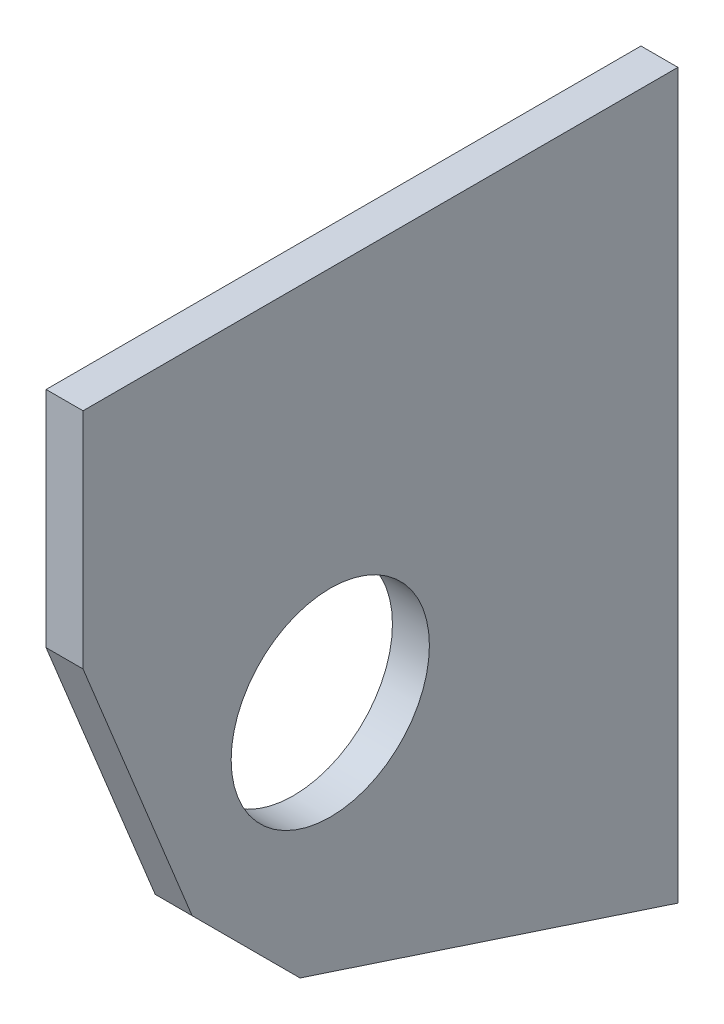
ISO-10303-21;
HEADER;
FILE_DESCRIPTION(('STEP AP214'),'2;1');
FILE_NAME('part.step','',(''),(''),'','','');
FILE_SCHEMA(('AUTOMOTIVE_DESIGN { 1 0 10303 214 1 1 1 1 }'));
ENDSEC;
DATA;
#1=APPLICATION_CONTEXT('core data for automotive mechanical design processes');
#2=APPLICATION_PROTOCOL_DEFINITION('international standard','automotive_design',2000,#1);
#3=PRODUCT_CONTEXT('',#1,'mechanical');
#4=PRODUCT('Part','Part','',(#3));
#5=PRODUCT_RELATED_PRODUCT_CATEGORY('part','',(#4));
#6=PRODUCT_DEFINITION_FORMATION('','',#4);
#7=PRODUCT_DEFINITION_CONTEXT('part definition',#1,'design');
#8=PRODUCT_DEFINITION('design','',#6,#7);
#9=PRODUCT_DEFINITION_SHAPE('','',#8);
#10=(LENGTH_UNIT() NAMED_UNIT(*) SI_UNIT(.MILLI.,.METRE.));
#11=(NAMED_UNIT(*) PLANE_ANGLE_UNIT() SI_UNIT($,.RADIAN.));
#12=(NAMED_UNIT(*) SI_UNIT($,.STERADIAN.) SOLID_ANGLE_UNIT());
#13=UNCERTAINTY_MEASURE_WITH_UNIT(LENGTH_MEASURE(1.E-05),#10,'distance_accuracy_value','');
#14=(GEOMETRIC_REPRESENTATION_CONTEXT(3) GLOBAL_UNCERTAINTY_ASSIGNED_CONTEXT((#13)) GLOBAL_UNIT_ASSIGNED_CONTEXT((#10,
#11,#12)) REPRESENTATION_CONTEXT('',''));
#15=CARTESIAN_POINT('',(0.,0.,0.));
#16=DIRECTION('',(0.,0.,1.));
#17=DIRECTION('',(1.,0.,0.));
#18=AXIS2_PLACEMENT_3D('',#15,#16,#17);
#19=CARTESIAN_POINT('',(372.757576,376.8764848,539.649989490237));
#20=DIRECTION('',(0.,0.,-1.));
#21=DIRECTION('',(0.,1.,0.));
#22=AXIS2_PLACEMENT_3D('',#19,#20,#21);
#23=PLANE('',#22);
#24=DIRECTION('',(0.,-1.,0.));
#25=VECTOR('',#24,1.);
#26=CARTESIAN_POINT('',(342.757576,376.8764848,539.649989490237));
#27=LINE('',#26,#25);
#28=CARTESIAN_POINT('',(342.757576,376.8764848,539.649989490237));
#29=VERTEX_POINT('',#28);
#30=CARTESIAN_POINT('',(342.757576,195.27714905055,539.649989490237));
#31=VERTEX_POINT('',#30);
#32=EDGE_CURVE('E175',#29,#31,#27,.T.);
#33=ORIENTED_EDGE('',*,*,#32,.T.);
#34=DIRECTION('',(-1.,0.,0.));
#35=VECTOR('',#34,1.);
#36=CARTESIAN_POINT('',(372.757576,195.27714905055,539.649989490237));
#37=LINE('',#36,#35);
#38=CARTESIAN_POINT('',(372.757576,195.27714905055,539.649989490237));
#39=VERTEX_POINT('',#38);
#40=EDGE_CURVE('E12',#39,#31,#37,.T.);
#41=ORIENTED_EDGE('',*,*,#40,.F.);
#42=DIRECTION('',(0.,-1.,0.));
#43=VECTOR('',#42,1.);
#44=CARTESIAN_POINT('',(372.757576,376.8764848,539.649989490237));
#45=LINE('',#44,#43);
#46=CARTESIAN_POINT('',(372.757576,376.8764848,539.649989490237));
#47=VERTEX_POINT('',#46);
#48=EDGE_CURVE('E186',#47,#39,#45,.T.);
#49=ORIENTED_EDGE('',*,*,#48,.F.);
#50=DIRECTION('',(-1.,0.,0.));
#51=VECTOR('',#50,1.);
#52=CARTESIAN_POINT('',(372.757576,376.8764848,539.649989490237));
#53=LINE('',#52,#51);
#54=EDGE_CURVE('E171',#47,#29,#53,.T.);
#55=ORIENTED_EDGE('',*,*,#54,.T.);
#56=EDGE_LOOP('',(#33,#41,#49,#55));
#57=FACE_BOUND('',#56,.T.);
#58=ADVANCED_FACE('F91',(#57),#23,.F.);
#59=CARTESIAN_POINT('',(372.757576,195.27714905055,539.649989490237));
#60=DIRECTION('',(0.,0.376797626926863,-0.926295605269875));
#61=DIRECTION('',(0.,0.926295605269875,0.376797626926864));
#62=AXIS2_PLACEMENT_3D('',#59,#60,#61);
#63=PLANE('',#62);
#64=DIRECTION('',(0.,-0.926295605269875,-0.376797626926864));
#65=VECTOR('',#64,1.);
#66=CARTESIAN_POINT('',(342.757576,195.27714905055,539.649989490237));
#67=LINE('',#66,#65);
#68=CARTESIAN_POINT('',(342.757576,-22.5796529721379,451.030411091063));
#69=VERTEX_POINT('',#68);
#70=EDGE_CURVE('E178',#31,#69,#67,.T.);
#71=ORIENTED_EDGE('',*,*,#70,.T.);
#72=DIRECTION('',(-1.,0.,0.));
#73=VECTOR('',#72,1.);
#74=CARTESIAN_POINT('',(372.757576,-22.5796529721379,451.030411091063));
#75=LINE('',#74,#73);
#76=CARTESIAN_POINT('',(372.757576,-22.5796529721379,451.030411091063));
#77=VERTEX_POINT('',#76);
#78=EDGE_CURVE('E99',#77,#69,#75,.T.);
#79=ORIENTED_EDGE('',*,*,#78,.F.);
#80=DIRECTION('',(0.,-0.926295605269875,-0.376797626926864));
#81=VECTOR('',#80,1.);
#82=CARTESIAN_POINT('',(372.757576,195.27714905055,539.649989490237));
#83=LINE('',#82,#81);
#84=EDGE_CURVE('E144',#39,#77,#83,.T.);
#85=ORIENTED_EDGE('',*,*,#84,.F.);
#86=ORIENTED_EDGE('',*,*,#40,.T.);
#87=EDGE_LOOP('',(#71,#79,#85,#86));
#88=FACE_BOUND('',#87,.T.);
#89=ADVANCED_FACE('F211',(#88),#63,.F.);
#90=CARTESIAN_POINT('',(372.757576,-22.5796529721379,451.030411091063));
#91=DIRECTION('',(0.,0.707106781038394,-0.707106781334701));
#92=DIRECTION('',(0.,0.707106781334701,0.707106781038394));
#93=AXIS2_PLACEMENT_3D('',#90,#91,#92);
#94=PLANE('',#93);
#95=DIRECTION('',(0.,-0.707106781334701,-0.707106781038394));
#96=VECTOR('',#95,1.);
#97=CARTESIAN_POINT('',(342.757576,-22.5796529721379,451.030411091063));
#98=LINE('',#97,#96);
#99=CARTESIAN_POINT('',(342.757576,-110.18361835915,363.42644574076));
#100=VERTEX_POINT('',#99);
#101=EDGE_CURVE('E181',#69,#100,#98,.T.);
#102=ORIENTED_EDGE('',*,*,#101,.T.);
#103=DIRECTION('',(-1.,0.,0.));
#104=VECTOR('',#103,1.);
#105=CARTESIAN_POINT('',(372.757576,-110.18361835915,363.42644574076));
#106=LINE('',#105,#104);
#107=CARTESIAN_POINT('',(372.757576,-110.18361835915,363.42644574076));
#108=VERTEX_POINT('',#107);
#109=EDGE_CURVE('E166',#108,#100,#106,.T.);
#110=ORIENTED_EDGE('',*,*,#109,.F.);
#111=DIRECTION('',(0.,-0.707106781334701,-0.707106781038394));
#112=VECTOR('',#111,1.);
#113=CARTESIAN_POINT('',(372.757576,-22.5796529721379,451.030411091063));
#114=LINE('',#113,#112);
#115=EDGE_CURVE('E157',#77,#108,#114,.T.);
#116=ORIENTED_EDGE('',*,*,#115,.F.);
#117=ORIENTED_EDGE('',*,*,#78,.T.);
#118=EDGE_LOOP('',(#102,#110,#116,#117));
#119=FACE_BOUND('',#118,.T.);
#120=ADVANCED_FACE('F192',(#119),#94,.F.);
#121=CARTESIAN_POINT('',(372.757576,-110.18361835915,363.42644574076));
#122=DIRECTION('',(0.,0.950075274116615,-0.312020790192319));
#123=DIRECTION('',(0.,0.312020790192319,0.950075274116615));
#124=AXIS2_PLACEMENT_3D('',#121,#122,#123);
#125=PLANE('',#124);
#126=DIRECTION('',(0.,-0.312020790192319,-0.950075274116615));
#127=VECTOR('',#126,1.);
#128=CARTESIAN_POINT('',(342.757576,-110.18361835915,363.42644574076));
#129=LINE('',#128,#127);
#130=CARTESIAN_POINT('',(342.757576,-210.973864260371,56.5292019902371));
#131=VERTEX_POINT('',#130);
#132=EDGE_CURVE('E165',#100,#131,#129,.T.);
#133=ORIENTED_EDGE('',*,*,#132,.T.);
#134=DIRECTION('',(-1.,0.,0.));
#135=VECTOR('',#134,1.);
#136=CARTESIAN_POINT('',(372.757576,-210.973864260371,56.5292019902371));
#137=LINE('',#136,#135);
#138=CARTESIAN_POINT('',(372.757576,-210.973864260371,56.5292019902371));
#139=VERTEX_POINT('',#138);
#140=EDGE_CURVE('E162',#139,#131,#137,.T.);
#141=ORIENTED_EDGE('',*,*,#140,.F.);
#142=DIRECTION('',(0.,-0.312020790192319,-0.950075274116615));
#143=VECTOR('',#142,1.);
#144=CARTESIAN_POINT('',(372.757576,-110.18361835915,363.42644574076));
#145=LINE('',#144,#143);
#146=EDGE_CURVE('E151',#108,#139,#145,.T.);
#147=ORIENTED_EDGE('',*,*,#146,.F.);
#148=ORIENTED_EDGE('',*,*,#109,.T.);
#149=EDGE_LOOP('',(#133,#141,#147,#148));
#150=FACE_BOUND('',#149,.T.);
#151=ADVANCED_FACE('F163',(#150),#125,.F.);
#152=CARTESIAN_POINT('',(372.757576,-210.973864260371,56.5292019902371));
#153=DIRECTION('',(0.,0.,1.));
#154=DIRECTION('',(1.,0.,0.));
#155=AXIS2_PLACEMENT_3D('',#152,#153,#154);
#156=PLANE('',#155);
#157=DIRECTION('',(0.,1.,0.));
#158=VECTOR('',#157,1.);
#159=CARTESIAN_POINT('',(342.757576,-210.973864260371,56.5292019902371));
#160=LINE('',#159,#158);
#161=CARTESIAN_POINT('',(342.757576,376.8764848,56.5292019902371));
#162=VERTEX_POINT('',#161);
#163=EDGE_CURVE('E130',#131,#162,#160,.T.);
#164=ORIENTED_EDGE('',*,*,#163,.T.);
#165=DIRECTION('',(-1.,0.,0.));
#166=VECTOR('',#165,1.);
#167=CARTESIAN_POINT('',(372.757576,376.8764848,56.5292019902371));
#168=LINE('',#167,#166);
#169=CARTESIAN_POINT('',(372.757576,376.8764848,56.5292019902371));
#170=VERTEX_POINT('',#169);
#171=EDGE_CURVE('E167',#170,#162,#168,.T.);
#172=ORIENTED_EDGE('',*,*,#171,.F.);
#173=DIRECTION('',(0.,1.,0.));
#174=VECTOR('',#173,1.);
#175=CARTESIAN_POINT('',(372.757576,-210.973864260371,56.5292019902371));
#176=LINE('',#175,#174);
#177=EDGE_CURVE('E155',#139,#170,#176,.T.);
#178=ORIENTED_EDGE('',*,*,#177,.F.);
#179=ORIENTED_EDGE('',*,*,#140,.T.);
#180=EDGE_LOOP('',(#164,#172,#178,#179));
#181=FACE_BOUND('',#180,.T.);
#182=ADVANCED_FACE('F169',(#181),#156,.F.);
#183=CARTESIAN_POINT('',(372.757576,376.8764848,56.5292019902371));
#184=DIRECTION('',(0.,-1.,0.));
#185=DIRECTION('',(0.,0.,-1.));
#186=AXIS2_PLACEMENT_3D('',#183,#184,#185);
#187=PLANE('',#186);
#188=DIRECTION('',(0.,0.,1.));
#189=VECTOR('',#188,1.);
#190=CARTESIAN_POINT('',(342.757576,376.8764848,56.5292019902371));
#191=LINE('',#190,#189);
#192=EDGE_CURVE('E136',#162,#29,#191,.T.);
#193=ORIENTED_EDGE('',*,*,#192,.T.);
#194=ORIENTED_EDGE('',*,*,#54,.F.);
#195=DIRECTION('',(0.,0.,1.));
#196=VECTOR('',#195,1.);
#197=CARTESIAN_POINT('',(372.757576,376.8764848,56.5292019902371));
#198=LINE('',#197,#196);
#199=EDGE_CURVE('E107',#170,#47,#198,.T.);
#200=ORIENTED_EDGE('',*,*,#199,.F.);
#201=ORIENTED_EDGE('',*,*,#171,.T.);
#202=EDGE_LOOP('',(#193,#194,#200,#201));
#203=FACE_BOUND('',#202,.T.);
#204=ADVANCED_FACE('F199',(#203),#187,.F.);
#205=CARTESIAN_POINT('',(372.757576,0.,0.));
#206=DIRECTION('',(-1.,0.,0.));
#207=DIRECTION('',(0.,0.,1.));
#208=AXIS2_PLACEMENT_3D('',#205,#206,#207);
#209=PLANE('',#208);
#210=CARTESIAN_POINT('',(372.757576,71.1929757396295,338.855641990237));
#211=DIRECTION('',(1.,0.,0.));
#212=DIRECTION('',(0.,0.,-1.));
#213=AXIS2_PLACEMENT_3D('',#210,#211,#212);
#214=CIRCLE('',#213,80.5000000000001);
#215=CARTESIAN_POINT('',(372.757576,71.1929757396295,258.355641990237));
#216=VERTEX_POINT('',#215);
#217=EDGE_CURVE('E266',#216,#216,#214,.T.);
#218=ORIENTED_EDGE('',*,*,#217,.F.);
#219=EDGE_LOOP('',(#218));
#220=FACE_BOUND('',#219,.T.);
#221=ORIENTED_EDGE('',*,*,#48,.T.);
#222=ORIENTED_EDGE('',*,*,#84,.T.);
#223=ORIENTED_EDGE('',*,*,#115,.T.);
#224=ORIENTED_EDGE('',*,*,#146,.T.);
#225=ORIENTED_EDGE('',*,*,#177,.T.);
#226=ORIENTED_EDGE('',*,*,#199,.T.);
#227=EDGE_LOOP('',(#221,#222,#223,#224,#225,#226));
#228=FACE_BOUND('',#227,.T.);
#229=ADVANCED_FACE('F153',(#220,#228),#209,.F.);
#230=CARTESIAN_POINT('',(342.757576,0.,0.));
#231=DIRECTION('',(-1.,0.,0.));
#232=DIRECTION('',(0.,0.,1.));
#233=AXIS2_PLACEMENT_3D('',#230,#231,#232);
#234=PLANE('',#233);
#235=CARTESIAN_POINT('',(342.757576,71.1929757396295,338.855641990237));
#236=DIRECTION('',(1.,0.,0.));
#237=DIRECTION('',(0.,0.,-1.));
#238=AXIS2_PLACEMENT_3D('',#235,#236,#237);
#239=CIRCLE('',#238,80.5000000000001);
#240=CARTESIAN_POINT('',(342.757576,71.1929757396295,258.355641990237));
#241=VERTEX_POINT('',#240);
#242=EDGE_CURVE('E179',#241,#241,#239,.T.);
#243=ORIENTED_EDGE('',*,*,#242,.T.);
#244=EDGE_LOOP('',(#243));
#245=FACE_BOUND('',#244,.T.);
#246=ORIENTED_EDGE('',*,*,#32,.F.);
#247=ORIENTED_EDGE('',*,*,#192,.F.);
#248=ORIENTED_EDGE('',*,*,#163,.F.);
#249=ORIENTED_EDGE('',*,*,#132,.F.);
#250=ORIENTED_EDGE('',*,*,#101,.F.);
#251=ORIENTED_EDGE('',*,*,#70,.F.);
#252=EDGE_LOOP('',(#246,#247,#248,#249,#250,#251));
#253=FACE_BOUND('',#252,.T.);
#254=ADVANCED_FACE('F195',(#245,#253),#234,.T.);
#255=CARTESIAN_POINT('',(342.757576,71.1929757396295,338.855641990237));
#256=DIRECTION('',(1.,0.,0.));
#257=DIRECTION('',(0.,0.,-1.));
#258=AXIS2_PLACEMENT_3D('',#255,#256,#257);
#259=CYLINDRICAL_SURFACE('',#258,80.5000000000001);
#260=ORIENTED_EDGE('',*,*,#242,.F.);
#261=EDGE_LOOP('',(#260));
#262=FACE_BOUND('',#261,.T.);
#263=ORIENTED_EDGE('',*,*,#217,.T.);
#264=EDGE_LOOP('',(#263));
#265=FACE_BOUND('',#264,.T.);
#266=ADVANCED_FACE('F248',(#262,#265),#259,.F.);
#267=CLOSED_SHELL('',(#58,#89,#120,#151,#182,#204,#229,#254,#266));
#268=MANIFOLD_SOLID_BREP('B2',#267);
#269=ADVANCED_BREP_SHAPE_REPRESENTATION('',(#18,#268),#14);
#270=SHAPE_DEFINITION_REPRESENTATION(#9,#269);
ENDSEC;
END-ISO-10303-21;
